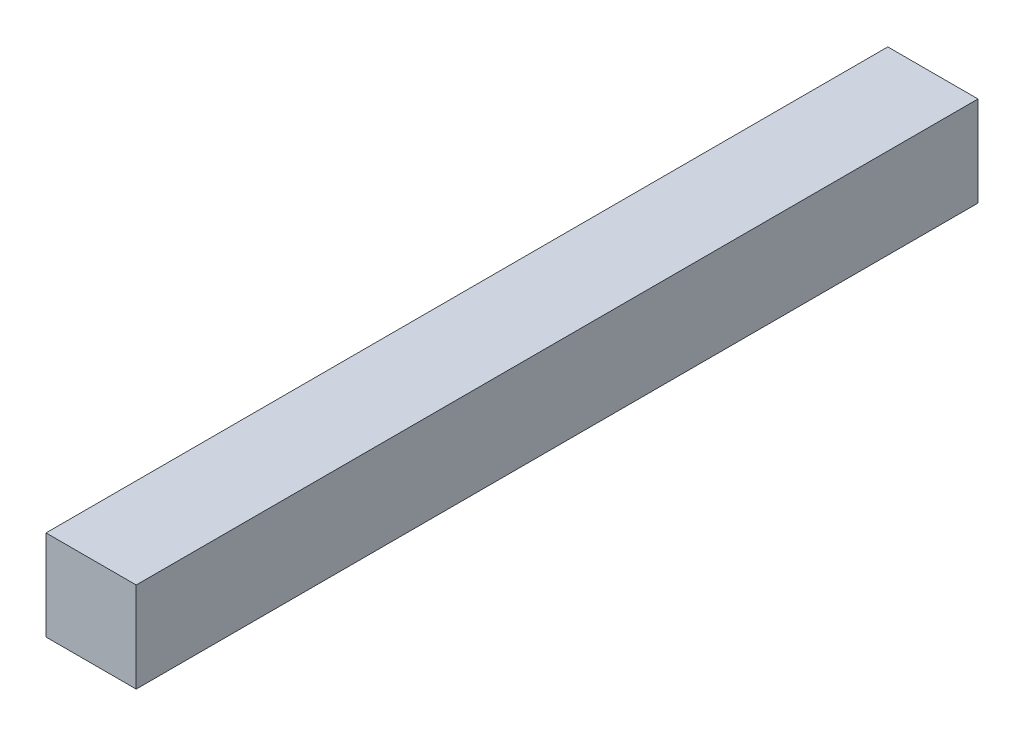
ISO-10303-21;
HEADER;
FILE_DESCRIPTION(('STEP AP214'),'2;1');
FILE_NAME('part.step','',(''),(''),'','','');
FILE_SCHEMA(('AUTOMOTIVE_DESIGN { 1 0 10303 214 1 1 1 1 }'));
ENDSEC;
DATA;
#1=APPLICATION_CONTEXT('core data for automotive mechanical design processes');
#2=APPLICATION_PROTOCOL_DEFINITION('international standard','automotive_design',2000,#1);
#3=PRODUCT_CONTEXT('',#1,'mechanical');
#4=PRODUCT('Part','Part','',(#3));
#5=PRODUCT_RELATED_PRODUCT_CATEGORY('part','',(#4));
#6=PRODUCT_DEFINITION_FORMATION('','',#4);
#7=PRODUCT_DEFINITION_CONTEXT('part definition',#1,'design');
#8=PRODUCT_DEFINITION('design','',#6,#7);
#9=PRODUCT_DEFINITION_SHAPE('','',#8);
#10=(LENGTH_UNIT() NAMED_UNIT(*) SI_UNIT(.MILLI.,.METRE.));
#11=(NAMED_UNIT(*) PLANE_ANGLE_UNIT() SI_UNIT($,.RADIAN.));
#12=(NAMED_UNIT(*) SI_UNIT($,.STERADIAN.) SOLID_ANGLE_UNIT());
#13=UNCERTAINTY_MEASURE_WITH_UNIT(LENGTH_MEASURE(1.E-05),#10,'distance_accuracy_value','');
#14=(GEOMETRIC_REPRESENTATION_CONTEXT(3) GLOBAL_UNCERTAINTY_ASSIGNED_CONTEXT((#13)) GLOBAL_UNIT_ASSIGNED_CONTEXT((#10,
#11,#12)) REPRESENTATION_CONTEXT('',''));
#15=CARTESIAN_POINT('',(0.,0.,0.));
#16=DIRECTION('',(0.,0.,1.));
#17=DIRECTION('',(1.,0.,0.));
#18=AXIS2_PLACEMENT_3D('',#15,#16,#17);
#19=CARTESIAN_POINT('',(1.190625,1.190625,-11.1125));
#20=DIRECTION('',(0.,1.,0.));
#21=DIRECTION('',(0.,0.,1.));
#22=AXIS2_PLACEMENT_3D('',#19,#20,#21);
#23=PLANE('',#22);
#24=DIRECTION('',(0.,0.,1.));
#25=VECTOR('',#24,1.);
#26=CARTESIAN_POINT('',(-1.190625,1.190625,-11.1125));
#27=LINE('',#26,#25);
#28=CARTESIAN_POINT('',(-1.190625,1.190625,-11.1125));
#29=VERTEX_POINT('',#28);
#30=CARTESIAN_POINT('',(-1.190625,1.190625,11.1125));
#31=VERTEX_POINT('',#30);
#32=EDGE_CURVE('E46',#29,#31,#27,.T.);
#33=ORIENTED_EDGE('',*,*,#32,.T.);
#34=DIRECTION('',(-1.,0.,0.));
#35=VECTOR('',#34,1.);
#36=CARTESIAN_POINT('',(1.190625,1.190625,11.1125));
#37=LINE('',#36,#35);
#38=CARTESIAN_POINT('',(1.190625,1.190625,11.1125));
#39=VERTEX_POINT('',#38);
#40=EDGE_CURVE('E84',#39,#31,#37,.T.);
#41=ORIENTED_EDGE('',*,*,#40,.F.);
#42=DIRECTION('',(0.,0.,1.));
#43=VECTOR('',#42,1.);
#44=CARTESIAN_POINT('',(1.190625,1.190625,-11.1125));
#45=LINE('',#44,#43);
#46=CARTESIAN_POINT('',(1.190625,1.190625,-11.1125));
#47=VERTEX_POINT('',#46);
#48=EDGE_CURVE('E11',#47,#39,#45,.T.);
#49=ORIENTED_EDGE('',*,*,#48,.F.);
#50=DIRECTION('',(-1.,0.,0.));
#51=VECTOR('',#50,1.);
#52=CARTESIAN_POINT('',(1.190625,1.190625,-11.1125));
#53=LINE('',#52,#51);
#54=EDGE_CURVE('E85',#47,#29,#53,.T.);
#55=ORIENTED_EDGE('',*,*,#54,.T.);
#56=EDGE_LOOP('',(#33,#41,#49,#55));
#57=FACE_BOUND('',#56,.T.);
#58=ADVANCED_FACE('F43',(#57),#23,.T.);
#59=CARTESIAN_POINT('',(1.190625,-1.190625,-11.1125));
#60=DIRECTION('',(1.,0.,0.));
#61=DIRECTION('',(0.,1.,0.));
#62=AXIS2_PLACEMENT_3D('',#59,#60,#61);
#63=PLANE('',#62);
#64=ORIENTED_EDGE('',*,*,#48,.T.);
#65=DIRECTION('',(0.,1.,0.));
#66=VECTOR('',#65,1.);
#67=CARTESIAN_POINT('',(1.190625,-1.190625,11.1125));
#68=LINE('',#67,#66);
#69=CARTESIAN_POINT('',(1.190625,-1.190625,11.1125));
#70=VERTEX_POINT('',#69);
#71=EDGE_CURVE('E103',#70,#39,#68,.T.);
#72=ORIENTED_EDGE('',*,*,#71,.F.);
#73=DIRECTION('',(0.,0.,1.));
#74=VECTOR('',#73,1.);
#75=CARTESIAN_POINT('',(1.190625,-1.190625,-11.1125));
#76=LINE('',#75,#74);
#77=CARTESIAN_POINT('',(1.190625,-1.190625,-11.1125));
#78=VERTEX_POINT('',#77);
#79=EDGE_CURVE('E52',#78,#70,#76,.T.);
#80=ORIENTED_EDGE('',*,*,#79,.F.);
#81=DIRECTION('',(0.,1.,0.));
#82=VECTOR('',#81,1.);
#83=CARTESIAN_POINT('',(1.190625,-1.190625,-11.1125));
#84=LINE('',#83,#82);
#85=EDGE_CURVE('E91',#78,#47,#84,.T.);
#86=ORIENTED_EDGE('',*,*,#85,.T.);
#87=EDGE_LOOP('',(#64,#72,#80,#86));
#88=FACE_BOUND('',#87,.T.);
#89=ADVANCED_FACE('F127',(#88),#63,.T.);
#90=CARTESIAN_POINT('',(-1.190625,-1.190625,-11.1125));
#91=DIRECTION('',(0.,-1.,0.));
#92=DIRECTION('',(0.,0.,-1.));
#93=AXIS2_PLACEMENT_3D('',#90,#91,#92);
#94=PLANE('',#93);
#95=ORIENTED_EDGE('',*,*,#79,.T.);
#96=DIRECTION('',(1.,0.,0.));
#97=VECTOR('',#96,1.);
#98=CARTESIAN_POINT('',(-1.190625,-1.190625,11.1125));
#99=LINE('',#98,#97);
#100=CARTESIAN_POINT('',(-1.190625,-1.190625,11.1125));
#101=VERTEX_POINT('',#100);
#102=EDGE_CURVE('E99',#101,#70,#99,.T.);
#103=ORIENTED_EDGE('',*,*,#102,.F.);
#104=DIRECTION('',(0.,0.,1.));
#105=VECTOR('',#104,1.);
#106=CARTESIAN_POINT('',(-1.190625,-1.190625,-11.1125));
#107=LINE('',#106,#105);
#108=CARTESIAN_POINT('',(-1.190625,-1.190625,-11.1125));
#109=VERTEX_POINT('',#108);
#110=EDGE_CURVE('E90',#109,#101,#107,.T.);
#111=ORIENTED_EDGE('',*,*,#110,.F.);
#112=DIRECTION('',(1.,0.,0.));
#113=VECTOR('',#112,1.);
#114=CARTESIAN_POINT('',(-1.190625,-1.190625,-11.1125));
#115=LINE('',#114,#113);
#116=EDGE_CURVE('E116',#109,#78,#115,.T.);
#117=ORIENTED_EDGE('',*,*,#116,.T.);
#118=EDGE_LOOP('',(#95,#103,#111,#117));
#119=FACE_BOUND('',#118,.T.);
#120=ADVANCED_FACE('F124',(#119),#94,.T.);
#121=CARTESIAN_POINT('',(-1.190625,1.190625,-11.1125));
#122=DIRECTION('',(-1.,0.,0.));
#123=DIRECTION('',(0.,-1.,0.));
#124=AXIS2_PLACEMENT_3D('',#121,#122,#123);
#125=PLANE('',#124);
#126=ORIENTED_EDGE('',*,*,#110,.T.);
#127=DIRECTION('',(0.,-1.,0.));
#128=VECTOR('',#127,1.);
#129=CARTESIAN_POINT('',(-1.190625,1.190625,11.1125));
#130=LINE('',#129,#128);
#131=EDGE_CURVE('E93',#31,#101,#130,.T.);
#132=ORIENTED_EDGE('',*,*,#131,.F.);
#133=ORIENTED_EDGE('',*,*,#32,.F.);
#134=DIRECTION('',(0.,-1.,0.));
#135=VECTOR('',#134,1.);
#136=CARTESIAN_POINT('',(-1.190625,1.190625,-11.1125));
#137=LINE('',#136,#135);
#138=EDGE_CURVE('E113',#29,#109,#137,.T.);
#139=ORIENTED_EDGE('',*,*,#138,.T.);
#140=EDGE_LOOP('',(#126,#132,#133,#139));
#141=FACE_BOUND('',#140,.T.);
#142=ADVANCED_FACE('F94',(#141),#125,.T.);
#143=CARTESIAN_POINT('',(0.,0.,-11.1125));
#144=DIRECTION('',(0.,0.,1.));
#145=DIRECTION('',(1.,0.,0.));
#146=AXIS2_PLACEMENT_3D('',#143,#144,#145);
#147=PLANE('',#146);
#148=ORIENTED_EDGE('',*,*,#54,.F.);
#149=ORIENTED_EDGE('',*,*,#85,.F.);
#150=ORIENTED_EDGE('',*,*,#116,.F.);
#151=ORIENTED_EDGE('',*,*,#138,.F.);
#152=EDGE_LOOP('',(#148,#149,#150,#151));
#153=FACE_BOUND('',#152,.T.);
#154=ADVANCED_FACE('F129',(#153),#147,.F.);
#155=CARTESIAN_POINT('',(0.,0.,11.1125));
#156=DIRECTION('',(0.,0.,1.));
#157=DIRECTION('',(1.,0.,0.));
#158=AXIS2_PLACEMENT_3D('',#155,#156,#157);
#159=PLANE('',#158);
#160=ORIENTED_EDGE('',*,*,#40,.T.);
#161=ORIENTED_EDGE('',*,*,#131,.T.);
#162=ORIENTED_EDGE('',*,*,#102,.T.);
#163=ORIENTED_EDGE('',*,*,#71,.T.);
#164=EDGE_LOOP('',(#160,#161,#162,#163));
#165=FACE_BOUND('',#164,.T.);
#166=ADVANCED_FACE('F102',(#165),#159,.T.);
#167=CLOSED_SHELL('',(#58,#89,#120,#142,#154,#166));
#168=MANIFOLD_SOLID_BREP('B2',#167);
#169=ADVANCED_BREP_SHAPE_REPRESENTATION('',(#18,#168),#14);
#170=SHAPE_DEFINITION_REPRESENTATION(#9,#169);
ENDSEC;
END-ISO-10303-21;
